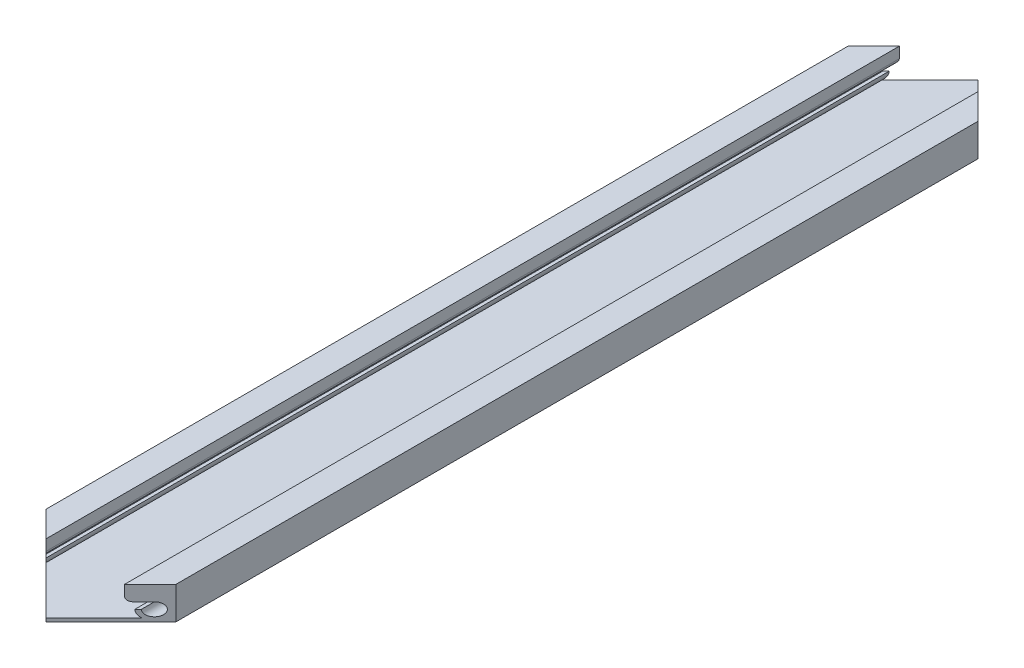
ISO-10303-21;
HEADER;
FILE_DESCRIPTION(('STEP AP214'),'2;1');
FILE_NAME('part.step','',(''),(''),'','','');
FILE_SCHEMA(('AUTOMOTIVE_DESIGN { 1 0 10303 214 1 1 1 1 }'));
ENDSEC;
DATA;
#1=APPLICATION_CONTEXT('core data for automotive mechanical design processes');
#2=APPLICATION_PROTOCOL_DEFINITION('international standard','automotive_design',2000,#1);
#3=PRODUCT_CONTEXT('',#1,'mechanical');
#4=PRODUCT('Part','Part','',(#3));
#5=PRODUCT_RELATED_PRODUCT_CATEGORY('part','',(#4));
#6=PRODUCT_DEFINITION_FORMATION('','',#4);
#7=PRODUCT_DEFINITION_CONTEXT('part definition',#1,'design');
#8=PRODUCT_DEFINITION('design','',#6,#7);
#9=PRODUCT_DEFINITION_SHAPE('','',#8);
#10=(LENGTH_UNIT() NAMED_UNIT(*) SI_UNIT(.MILLI.,.METRE.));
#11=(NAMED_UNIT(*) PLANE_ANGLE_UNIT() SI_UNIT($,.RADIAN.));
#12=(NAMED_UNIT(*) SI_UNIT($,.STERADIAN.) SOLID_ANGLE_UNIT());
#13=UNCERTAINTY_MEASURE_WITH_UNIT(LENGTH_MEASURE(1.E-05),#10,'distance_accuracy_value','');
#14=(GEOMETRIC_REPRESENTATION_CONTEXT(3) GLOBAL_UNCERTAINTY_ASSIGNED_CONTEXT((#13)) GLOBAL_UNIT_ASSIGNED_CONTEXT((#10,
#11,#12)) REPRESENTATION_CONTEXT('',''));
#15=CARTESIAN_POINT('',(0.,0.,0.));
#16=DIRECTION('',(0.,0.,1.));
#17=DIRECTION('',(1.,0.,0.));
#18=AXIS2_PLACEMENT_3D('',#15,#16,#17);
#19=CARTESIAN_POINT('',(-30.,-7.4999999999987,430.));
#20=DIRECTION('',(0.,1.,0.));
#21=DIRECTION('',(0.,0.,1.));
#22=AXIS2_PLACEMENT_3D('',#19,#20,#21);
#23=PLANE('',#22);
#24=DIRECTION('',(-0.707106781186552,0.,0.707106781186538));
#25=VECTOR('',#24,1.);
#26=CARTESIAN_POINT('',(215.000000000001,-7.4999999999987,215.000000000003));
#27=LINE('',#26,#25);
#28=CARTESIAN_POINT('',(30.,-7.49999999999998,400.000000000006));
#29=VERTEX_POINT('',#28);
#30=CARTESIAN_POINT('',(0.,-7.4999999999987,430.));
#31=VERTEX_POINT('',#30);
#32=EDGE_CURVE('E362',#29,#31,#27,.T.);
#33=ORIENTED_EDGE('',*,*,#32,.T.);
#34=DIRECTION('',(0.707106781186552,0.,0.707106781186538));
#35=VECTOR('',#34,1.);
#36=CARTESIAN_POINT('',(-215.,-7.50000000000001,215.000000000013));
#37=LINE('',#36,#35);
#38=CARTESIAN_POINT('',(-30.,-7.49999999999998,400.));
#39=VERTEX_POINT('',#38);
#40=EDGE_CURVE('E228',#39,#31,#37,.T.);
#41=ORIENTED_EDGE('',*,*,#40,.F.);
#42=DIRECTION('',(0.,0.,-1.));
#43=VECTOR('',#42,1.);
#44=CARTESIAN_POINT('',(-30.,-7.4999999999987,430.));
#45=LINE('',#44,#43);
#46=CARTESIAN_POINT('',(-30.,-7.4999999999987,29.9999999999998));
#47=VERTEX_POINT('',#46);
#48=EDGE_CURVE('E237',#39,#47,#45,.T.);
#49=ORIENTED_EDGE('',*,*,#48,.T.);
#50=DIRECTION('',(0.707106781186552,0.,-0.707106781186538));
#51=VECTOR('',#50,1.);
#52=CARTESIAN_POINT('',(0.,-7.50000000000001,-1.04360964314765E-11));
#53=LINE('',#52,#51);
#54=CARTESIAN_POINT('',(0.,-7.50000000000001,-1.04360964314765E-11));
#55=VERTEX_POINT('',#54);
#56=EDGE_CURVE('E366',#47,#55,#53,.T.);
#57=ORIENTED_EDGE('',*,*,#56,.T.);
#58=DIRECTION('',(-0.707106781186552,0.,-0.707106781186538));
#59=VECTOR('',#58,1.);
#60=CARTESIAN_POINT('',(0.,-7.50000000000001,-1.04360964314765E-11));
#61=LINE('',#60,#59);
#62=CARTESIAN_POINT('',(30.,-7.4999999999987,29.9999999999996));
#63=VERTEX_POINT('',#62);
#64=EDGE_CURVE('E365',#63,#55,#61,.T.);
#65=ORIENTED_EDGE('',*,*,#64,.F.);
#66=DIRECTION('',(0.,0.,-1.));
#67=VECTOR('',#66,1.);
#68=CARTESIAN_POINT('',(30.,-7.4999999999987,430.000000000005));
#69=LINE('',#68,#67);
#70=EDGE_CURVE('E252',#29,#63,#69,.T.);
#71=ORIENTED_EDGE('',*,*,#70,.F.);
#72=EDGE_LOOP('',(#33,#41,#49,#57,#65,#71));
#73=FACE_BOUND('',#72,.T.);
#74=ADVANCED_FACE('F80',(#73),#23,.F.);
#75=CARTESIAN_POINT('',(22.1715728752538,-5.9999999999987,430.));
#76=DIRECTION('',(0.,-1.,0.));
#77=DIRECTION('',(0.,0.,-1.));
#78=AXIS2_PLACEMENT_3D('',#75,#76,#77);
#79=PLANE('',#78);
#80=DIRECTION('',(0.,0.,-1.));
#81=VECTOR('',#80,1.);
#82=CARTESIAN_POINT('',(-22.1715728752538,-5.9999999999987,430.));
#83=LINE('',#82,#81);
#84=CARTESIAN_POINT('',(-22.1715728752538,-5.99999999999998,407.828427124752));
#85=VERTEX_POINT('',#84);
#86=CARTESIAN_POINT('',(-22.1715728752538,-6.00000000000001,22.1715728752638));
#87=VERTEX_POINT('',#86);
#88=EDGE_CURVE('E343',#85,#87,#83,.T.);
#89=ORIENTED_EDGE('',*,*,#88,.F.);
#90=DIRECTION('',(0.707106781186552,0.,0.707106781186538));
#91=VECTOR('',#90,1.);
#92=CARTESIAN_POINT('',(11.085786437627,-6.00000000000001,441.085786437632));
#93=LINE('',#92,#91);
#94=CARTESIAN_POINT('',(0.,-5.9999999999987,430.));
#95=VERTEX_POINT('',#94);
#96=EDGE_CURVE('E417',#85,#95,#93,.T.);
#97=ORIENTED_EDGE('',*,*,#96,.T.);
#98=DIRECTION('',(-0.707106781186552,0.,0.707106781186538));
#99=VECTOR('',#98,1.);
#100=CARTESIAN_POINT('',(11.0857864376271,-6.00000000000001,418.914213562373));
#101=LINE('',#100,#99);
#102=CARTESIAN_POINT('',(22.1715728752538,-5.99999999999998,407.828427124747));
#103=VERTEX_POINT('',#102);
#104=EDGE_CURVE('E320',#103,#95,#101,.T.);
#105=ORIENTED_EDGE('',*,*,#104,.F.);
#106=DIRECTION('',(0.,0.,-1.));
#107=VECTOR('',#106,1.);
#108=CARTESIAN_POINT('',(22.1715728752538,-5.9999999999987,430.));
#109=LINE('',#108,#107);
#110=CARTESIAN_POINT('',(22.1715728752537,-6.00000000000001,22.1715728752536));
#111=VERTEX_POINT('',#110);
#112=EDGE_CURVE('E326',#103,#111,#109,.T.);
#113=ORIENTED_EDGE('',*,*,#112,.T.);
#114=DIRECTION('',(-0.707106781186552,0.,-0.707106781186538));
#115=VECTOR('',#114,1.);
#116=CARTESIAN_POINT('',(226.085786437627,-5.9999999999987,226.08578643763));
#117=LINE('',#116,#115);
#118=CARTESIAN_POINT('',(0.,-5.9999999999987,0.));
#119=VERTEX_POINT('',#118);
#120=EDGE_CURVE('E311',#111,#119,#117,.T.);
#121=ORIENTED_EDGE('',*,*,#120,.T.);
#122=DIRECTION('',(0.707106781186552,0.,-0.707106781186538));
#123=VECTOR('',#122,1.);
#124=CARTESIAN_POINT('',(-203.914213562373,-5.99999999999998,203.914213562371));
#125=LINE('',#124,#123);
#126=EDGE_CURVE('E370',#87,#119,#125,.T.);
#127=ORIENTED_EDGE('',*,*,#126,.F.);
#128=EDGE_LOOP('',(#89,#97,#105,#113,#121,#127));
#129=FACE_BOUND('',#128,.T.);
#130=ADVANCED_FACE('F402',(#129),#79,.F.);
#131=CARTESIAN_POINT('',(-30.,7.49999999999998,430.));
#132=DIRECTION('',(0.,-1.,0.));
#133=DIRECTION('',(0.,0.,-1.));
#134=AXIS2_PLACEMENT_3D('',#131,#132,#133);
#135=PLANE('',#134);
#136=DIRECTION('',(0.,0.,-1.));
#137=VECTOR('',#136,1.);
#138=CARTESIAN_POINT('',(-30.,7.49999999999998,430.));
#139=LINE('',#138,#137);
#140=CARTESIAN_POINT('',(-30.,7.50000000000001,400.));
#141=VERTEX_POINT('',#140);
#142=CARTESIAN_POINT('',(-30.,7.50000000000001,29.9999999999998));
#143=VERTEX_POINT('',#142);
#144=EDGE_CURVE('E235',#141,#143,#139,.T.);
#145=ORIENTED_EDGE('',*,*,#144,.F.);
#146=DIRECTION('',(0.707106781186552,0.,0.707106781186538));
#147=VECTOR('',#146,1.);
#148=CARTESIAN_POINT('',(-215.,7.50000000000131,215.000000000008));
#149=LINE('',#148,#147);
#150=CARTESIAN_POINT('',(-18.1568883594903,7.50000000000003,411.84311164051));
#151=VERTEX_POINT('',#150);
#152=EDGE_CURVE('E216',#141,#151,#149,.T.);
#153=ORIENTED_EDGE('',*,*,#152,.T.);
#154=DIRECTION('',(0.,0.,-1.));
#155=VECTOR('',#154,1.);
#156=CARTESIAN_POINT('',(-18.1568883594903,7.49999999999998,430.));
#157=LINE('',#156,#155);
#158=CARTESIAN_POINT('',(-18.1568883594903,7.50000000000001,18.1568883594903));
#159=VERTEX_POINT('',#158);
#160=EDGE_CURVE('E323',#151,#159,#157,.T.);
#161=ORIENTED_EDGE('',*,*,#160,.T.);
#162=DIRECTION('',(0.707106781186552,0.,-0.707106781186538));
#163=VECTOR('',#162,1.);
#164=CARTESIAN_POINT('',(0.,7.50000000000001,-1.04360964314765E-11));
#165=LINE('',#164,#163);
#166=EDGE_CURVE('E243',#143,#159,#165,.T.);
#167=ORIENTED_EDGE('',*,*,#166,.F.);
#168=EDGE_LOOP('',(#145,#153,#161,#167));
#169=FACE_BOUND('',#168,.T.);
#170=ADVANCED_FACE('F242',(#169),#135,.F.);
#171=CARTESIAN_POINT('',(25.,0.5,430.));
#172=DIRECTION('',(0.,1.,0.));
#173=DIRECTION('',(-1.,0.,0.));
#174=AXIS2_PLACEMENT_3D('',#171,#172,#173);
#175=PLANE('',#174);
#176=DIRECTION('',(0.,0.,-1.));
#177=VECTOR('',#176,1.);
#178=CARTESIAN_POINT('',(-20.1568883594903,0.5,430.));
#179=LINE('',#178,#177);
#180=CARTESIAN_POINT('',(-20.1568883594902,0.5,20.1568883595005));
#181=VERTEX_POINT('',#180);
#182=CARTESIAN_POINT('',(-20.1568883594903,0.500000000001305,409.84311164051));
#183=VERTEX_POINT('',#182);
#184=EDGE_CURVE('E267',#181,#183,#179,.F.);
#185=ORIENTED_EDGE('',*,*,#184,.T.);
#186=DIRECTION('',(-0.707106781186552,0.,-0.707106781186538));
#187=VECTOR('',#186,1.);
#188=CARTESIAN_POINT('',(12.5000000000002,0.5,442.500000000005));
#189=LINE('',#188,#187);
#190=CARTESIAN_POINT('',(-25.,0.500000000001305,405.));
#191=VERTEX_POINT('',#190);
#192=EDGE_CURVE('E466',#183,#191,#189,.T.);
#193=ORIENTED_EDGE('',*,*,#192,.T.);
#194=DIRECTION('',(0.,0.,-1.));
#195=VECTOR('',#194,1.);
#196=CARTESIAN_POINT('',(-25.,0.5,430.));
#197=LINE('',#196,#195);
#198=CARTESIAN_POINT('',(-25.,0.500000000001305,24.9999999999995));
#199=VERTEX_POINT('',#198);
#200=EDGE_CURVE('E335',#191,#199,#197,.T.);
#201=ORIENTED_EDGE('',*,*,#200,.T.);
#202=DIRECTION('',(-0.707106781186552,0.,0.707106781186538));
#203=VECTOR('',#202,1.);
#204=CARTESIAN_POINT('',(-202.5,0.500000000001305,202.499999999997));
#205=LINE('',#204,#203);
#206=EDGE_CURVE('E434',#181,#199,#205,.T.);
#207=ORIENTED_EDGE('',*,*,#206,.F.);
#208=EDGE_LOOP('',(#185,#193,#201,#207));
#209=FACE_BOUND('',#208,.T.);
#210=ADVANCED_FACE('F491',(#209),#175,.F.);
#211=CARTESIAN_POINT('',(-30.,7.49999999999998,430.));
#212=DIRECTION('',(1.,0.,0.));
#213=DIRECTION('',(0.,1.,0.));
#214=AXIS2_PLACEMENT_3D('',#211,#212,#213);
#215=PLANE('',#214);
#216=ORIENTED_EDGE('',*,*,#48,.F.);
#217=DIRECTION('',(0.,-1.,0.));
#218=VECTOR('',#217,1.);
#219=CARTESIAN_POINT('',(-30.,7.50000000000001,400.));
#220=LINE('',#219,#218);
#221=EDGE_CURVE('E219',#141,#39,#220,.T.);
#222=ORIENTED_EDGE('',*,*,#221,.F.);
#223=ORIENTED_EDGE('',*,*,#144,.T.);
#224=DIRECTION('',(0.,-1.,0.));
#225=VECTOR('',#224,1.);
#226=CARTESIAN_POINT('',(-30.,7.50000000000001,29.9999999999998));
#227=LINE('',#226,#225);
#228=EDGE_CURVE('E453',#143,#47,#227,.T.);
#229=ORIENTED_EDGE('',*,*,#228,.T.);
#230=EDGE_LOOP('',(#216,#222,#223,#229));
#231=FACE_BOUND('',#230,.T.);
#232=ADVANCED_FACE('F233',(#231),#215,.F.);
#233=CARTESIAN_POINT('',(-25.,-2.4999999999987,430.));
#234=DIRECTION('',(0.,0.,-1.));
#235=DIRECTION('',(-1.,0.,0.));
#236=AXIS2_PLACEMENT_3D('',#233,#234,#235);
#237=CYLINDRICAL_SURFACE('',#236,3.);
#238=ORIENTED_EDGE('',*,*,#200,.F.);
#239=CARTESIAN_POINT('',(-25.,-2.5,405.));
#240=DIRECTION('',(0.707106781186544,0.,-0.707106781186546));
#241=DIRECTION('',(-0.707106781186552,0.,-0.707106781186538));
#242=AXIS2_PLACEMENT_3D('',#239,#240,#241);
#243=ELLIPSE('',#242,4.24264068711927,3.);
#244=CARTESIAN_POINT('',(-22.,-2.5,408.000000000005));
#245=VERTEX_POINT('',#244);
#246=EDGE_CURVE('E470',#191,#245,#243,.F.);
#247=ORIENTED_EDGE('',*,*,#246,.T.);
#248=DIRECTION('',(0.,0.,-1.));
#249=VECTOR('',#248,1.);
#250=CARTESIAN_POINT('',(-22.,-2.4999999999987,430.));
#251=LINE('',#250,#249);
#252=CARTESIAN_POINT('',(-22.,-2.4999999999987,22.00000000001));
#253=VERTEX_POINT('',#252);
#254=EDGE_CURVE('E259',#245,#253,#251,.T.);
#255=ORIENTED_EDGE('',*,*,#254,.T.);
#256=CARTESIAN_POINT('',(-25.,-2.4999999999987,24.9999999999997));
#257=DIRECTION('',(-0.707106781186543,0.,-0.707106781186546));
#258=DIRECTION('',(0.707106781186552,0.,-0.707106781186538));
#259=AXIS2_PLACEMENT_3D('',#256,#257,#258);
#260=ELLIPSE('',#259,4.24264068711927,3.);
#261=EDGE_CURVE('E437',#199,#253,#260,.F.);
#262=ORIENTED_EDGE('',*,*,#261,.F.);
#263=EDGE_LOOP('',(#238,#247,#255,#262));
#264=FACE_BOUND('',#263,.T.);
#265=ADVANCED_FACE('F488',(#264),#237,.F.);
#266=CARTESIAN_POINT('',(-25.,-2.4999999999987,430.));
#267=DIRECTION('',(0.,-1.,0.));
#268=DIRECTION('',(1.,0.,0.));
#269=AXIS2_PLACEMENT_3D('',#266,#267,#268);
#270=PLANE('',#269);
#271=ORIENTED_EDGE('',*,*,#254,.F.);
#272=DIRECTION('',(0.707106781186552,0.,0.707106781186538));
#273=VECTOR('',#272,1.);
#274=CARTESIAN_POINT('',(-12.5000000000001,-2.5,417.5));
#275=LINE('',#274,#273);
#276=CARTESIAN_POINT('',(-20.5,-2.4999999999987,409.5));
#277=VERTEX_POINT('',#276);
#278=EDGE_CURVE('E428',#245,#277,#275,.T.);
#279=ORIENTED_EDGE('',*,*,#278,.T.);
#280=DIRECTION('',(0.,0.,-1.));
#281=VECTOR('',#280,1.);
#282=CARTESIAN_POINT('',(-20.5,-2.4999999999987,430.));
#283=LINE('',#282,#281);
#284=CARTESIAN_POINT('',(-20.5,-2.49999999999992,20.4999999999895));
#285=VERTEX_POINT('',#284);
#286=EDGE_CURVE('E339',#277,#285,#283,.T.);
#287=ORIENTED_EDGE('',*,*,#286,.T.);
#288=DIRECTION('',(0.707106781186552,0.,-0.707106781186538));
#289=VECTOR('',#288,1.);
#290=CARTESIAN_POINT('',(-227.5,-2.49999999999864,227.499999999997));
#291=LINE('',#290,#289);
#292=EDGE_CURVE('E440',#253,#285,#291,.T.);
#293=ORIENTED_EDGE('',*,*,#292,.F.);
#294=EDGE_LOOP('',(#271,#279,#287,#293));
#295=FACE_BOUND('',#294,.T.);
#296=ADVANCED_FACE('F478',(#295),#270,.F.);
#297=CARTESIAN_POINT('',(-25.,-2.4999999999987,430.));
#298=DIRECTION('',(0.,0.,-1.));
#299=DIRECTION('',(-1.,0.,0.));
#300=AXIS2_PLACEMENT_3D('',#297,#298,#299);
#301=CYLINDRICAL_SURFACE('',#300,4.5);
#302=ORIENTED_EDGE('',*,*,#286,.F.);
#303=CARTESIAN_POINT('',(-25.,-2.5,405.));
#304=DIRECTION('',(0.707106781186544,0.,-0.707106781186546));
#305=DIRECTION('',(-0.707106781186552,0.,-0.707106781186538));
#306=AXIS2_PLACEMENT_3D('',#303,#304,#305);
#307=ELLIPSE('',#306,6.3639610306789,4.5);
#308=EDGE_CURVE('E421',#277,#85,#307,.T.);
#309=ORIENTED_EDGE('',*,*,#308,.T.);
#310=ORIENTED_EDGE('',*,*,#88,.T.);
#311=CARTESIAN_POINT('',(-25.,-2.4999999999987,24.9999999999997));
#312=DIRECTION('',(-0.707106781186543,0.,-0.707106781186546));
#313=DIRECTION('',(0.707106781186552,0.,-0.707106781186538));
#314=AXIS2_PLACEMENT_3D('',#311,#312,#313);
#315=ELLIPSE('',#314,6.3639610306789,4.5);
#316=EDGE_CURVE('E375',#285,#87,#315,.T.);
#317=ORIENTED_EDGE('',*,*,#316,.F.);
#318=EDGE_LOOP('',(#302,#309,#310,#317));
#319=FACE_BOUND('',#318,.T.);
#320=ADVANCED_FACE('F482',(#319),#301,.T.);
#321=CARTESIAN_POINT('',(-18.1568883594903,7.49999999999998,430.));
#322=DIRECTION('',(-1.,0.,0.));
#323=DIRECTION('',(0.,0.,1.));
#324=AXIS2_PLACEMENT_3D('',#321,#322,#323);
#325=PLANE('',#324);
#326=ORIENTED_EDGE('',*,*,#160,.F.);
#327=DIRECTION('',(0.,-1.,0.));
#328=VECTOR('',#327,1.);
#329=CARTESIAN_POINT('',(-18.1568883594903,7.50000000000003,411.84311164051));
#330=LINE('',#329,#328);
#331=CARTESIAN_POINT('',(-18.1568883594903,2.50000000000131,411.84311164051));
#332=VERTEX_POINT('',#331);
#333=EDGE_CURVE('E222',#151,#332,#330,.T.);
#334=ORIENTED_EDGE('',*,*,#333,.T.);
#335=DIRECTION('',(0.,0.,-1.));
#336=VECTOR('',#335,1.);
#337=CARTESIAN_POINT('',(-18.1568883594903,2.50000000000131,430.000000000005));
#338=LINE('',#337,#336);
#339=CARTESIAN_POINT('',(-18.1568883594903,2.5,18.1568883595005));
#340=VERTEX_POINT('',#339);
#341=EDGE_CURVE('E263',#332,#340,#338,.T.);
#342=ORIENTED_EDGE('',*,*,#341,.T.);
#343=DIRECTION('',(0.,-1.,0.));
#344=VECTOR('',#343,1.);
#345=CARTESIAN_POINT('',(-18.1568883594903,7.50000000000001,18.15688835949));
#346=LINE('',#345,#344);
#347=EDGE_CURVE('E426',#159,#340,#346,.T.);
#348=ORIENTED_EDGE('',*,*,#347,.F.);
#349=EDGE_LOOP('',(#326,#334,#342,#348));
#350=FACE_BOUND('',#349,.T.);
#351=ADVANCED_FACE('F498',(#350),#325,.F.);
#352=CARTESIAN_POINT('',(-20.1568883594903,2.50000000000131,430.000000000005));
#353=DIRECTION('',(0.,0.,-1.));
#354=DIRECTION('',(-1.,0.,0.));
#355=AXIS2_PLACEMENT_3D('',#352,#353,#354);
#356=CYLINDRICAL_SURFACE('',#355,2.);
#357=CARTESIAN_POINT('',(-20.1568883594903,2.5,409.84311164051));
#358=DIRECTION('',(0.707106781186544,0.,-0.707106781186546));
#359=DIRECTION('',(-0.707106781186552,0.,-0.707106781186538));
#360=AXIS2_PLACEMENT_3D('',#357,#358,#359);
#361=ELLIPSE('',#360,2.82842712474617,2.);
#362=EDGE_CURVE('E239',#183,#332,#361,.F.);
#363=ORIENTED_EDGE('',*,*,#362,.F.);
#364=ORIENTED_EDGE('',*,*,#184,.F.);
#365=CARTESIAN_POINT('',(-20.1568883594902,2.5,20.15688835949));
#366=DIRECTION('',(-0.707106781186543,0.,-0.707106781186546));
#367=DIRECTION('',(0.707106781186552,0.,-0.707106781186538));
#368=AXIS2_PLACEMENT_3D('',#365,#366,#367);
#369=ELLIPSE('',#368,2.82842712474617,2.);
#370=EDGE_CURVE('E420',#181,#340,#369,.F.);
#371=ORIENTED_EDGE('',*,*,#370,.T.);
#372=ORIENTED_EDGE('',*,*,#341,.F.);
#373=EDGE_LOOP('',(#363,#364,#371,#372));
#374=FACE_BOUND('',#373,.T.);
#375=ADVANCED_FACE('F495',(#374),#356,.T.);
#376=CARTESIAN_POINT('',(30.,7.49999999999998,430.));
#377=DIRECTION('',(-1.,0.,0.));
#378=DIRECTION('',(0.,-1.,0.));
#379=AXIS2_PLACEMENT_3D('',#376,#377,#378);
#380=PLANE('',#379);
#381=DIRECTION('',(0.,-1.,0.));
#382=VECTOR('',#381,1.);
#383=CARTESIAN_POINT('',(30.,7.50000000000001,400.));
#384=LINE('',#383,#382);
#385=CARTESIAN_POINT('',(30.,7.50000000000001,400.));
#386=VERTEX_POINT('',#385);
#387=EDGE_CURVE('E358',#386,#29,#384,.T.);
#388=ORIENTED_EDGE('',*,*,#387,.T.);
#389=ORIENTED_EDGE('',*,*,#70,.T.);
#390=DIRECTION('',(0.,-1.,0.));
#391=VECTOR('',#390,1.);
#392=CARTESIAN_POINT('',(30.,7.5000000000012,29.9999999999894));
#393=LINE('',#392,#391);
#394=CARTESIAN_POINT('',(30.,7.5000000000012,29.9999999999894));
#395=VERTEX_POINT('',#394);
#396=EDGE_CURVE('E357',#395,#63,#393,.T.);
#397=ORIENTED_EDGE('',*,*,#396,.F.);
#398=DIRECTION('',(0.,0.,-1.));
#399=VECTOR('',#398,1.);
#400=CARTESIAN_POINT('',(30.,7.49999999999998,430.));
#401=LINE('',#400,#399);
#402=EDGE_CURVE('E245',#386,#395,#401,.T.);
#403=ORIENTED_EDGE('',*,*,#402,.F.);
#404=EDGE_LOOP('',(#388,#389,#397,#403));
#405=FACE_BOUND('',#404,.T.);
#406=ADVANCED_FACE('F355',(#405),#380,.F.);
#407=DIRECTION('',(-0.707106781186552,0.,0.707106781186538));
#408=VECTOR('',#407,1.);
#409=CARTESIAN_POINT('',(215.000000000001,7.50000000000128,215.000000000003));
#410=LINE('',#409,#408);
#411=CARTESIAN_POINT('',(18.1431116405097,7.50000000000128,411.85688835949));
#412=VERTEX_POINT('',#411);
#413=EDGE_CURVE('E445',#386,#412,#410,.T.);
#414=ORIENTED_EDGE('',*,*,#413,.F.);
#415=ORIENTED_EDGE('',*,*,#402,.T.);
#416=DIRECTION('',(-0.707106781186552,0.,-0.707106781186538));
#417=VECTOR('',#416,1.);
#418=CARTESIAN_POINT('',(0.,7.50000000000001,-1.04360964314765E-11));
#419=LINE('',#418,#417);
#420=CARTESIAN_POINT('',(18.1431116405097,7.50000000000131,18.1431116405095));
#421=VERTEX_POINT('',#420);
#422=EDGE_CURVE('E369',#395,#421,#419,.T.);
#423=ORIENTED_EDGE('',*,*,#422,.T.);
#424=DIRECTION('',(0.,0.,-1.));
#425=VECTOR('',#424,1.);
#426=CARTESIAN_POINT('',(18.1431116405097,7.49999999999998,430.));
#427=LINE('',#426,#425);
#428=EDGE_CURVE('E290',#412,#421,#427,.T.);
#429=ORIENTED_EDGE('',*,*,#428,.F.);
#430=EDGE_LOOP('',(#414,#415,#423,#429));
#431=FACE_BOUND('',#430,.T.);
#432=ADVANCED_FACE('F520',(#431),#135,.F.);
#433=CARTESIAN_POINT('',(25.,-2.4999999999987,430.));
#434=DIRECTION('',(0.,0.,-1.));
#435=DIRECTION('',(-1.,0.,0.));
#436=AXIS2_PLACEMENT_3D('',#433,#434,#435);
#437=CYLINDRICAL_SURFACE('',#436,3.);
#438=CARTESIAN_POINT('',(25.,-2.5,405.000000000006));
#439=DIRECTION('',(0.707106781186543,0.,0.707106781186546));
#440=DIRECTION('',(0.707106781186552,0.,-0.707106781186538));
#441=AXIS2_PLACEMENT_3D('',#438,#439,#440);
#442=ELLIPSE('',#441,4.24264068711926,3.);
#443=CARTESIAN_POINT('',(25.,0.500000000001305,405.000000000006));
#444=VERTEX_POINT('',#443);
#445=CARTESIAN_POINT('',(22.,-2.5,408.));
#446=VERTEX_POINT('',#445);
#447=EDGE_CURVE('E305',#444,#446,#442,.F.);
#448=ORIENTED_EDGE('',*,*,#447,.F.);
#449=DIRECTION('',(0.,0.,-1.));
#450=VECTOR('',#449,1.);
#451=CARTESIAN_POINT('',(25.,0.5,430.));
#452=LINE('',#451,#450);
#453=CARTESIAN_POINT('',(25.,0.500000000001305,24.9999999999893));
#454=VERTEX_POINT('',#453);
#455=EDGE_CURVE('E303',#444,#454,#452,.T.);
#456=ORIENTED_EDGE('',*,*,#455,.T.);
#457=CARTESIAN_POINT('',(25.,-2.4999999999987,24.9999999999997));
#458=DIRECTION('',(-0.707106781186543,0.,0.707106781186547));
#459=DIRECTION('',(-0.707106781186552,0.,-0.707106781186538));
#460=AXIS2_PLACEMENT_3D('',#457,#458,#459);
#461=ELLIPSE('',#460,4.24264068711926,3.);
#462=CARTESIAN_POINT('',(22.,-2.4999999999987,21.9999999999998));
#463=VERTEX_POINT('',#462);
#464=EDGE_CURVE('E386',#454,#463,#461,.F.);
#465=ORIENTED_EDGE('',*,*,#464,.T.);
#466=DIRECTION('',(0.,0.,-1.));
#467=VECTOR('',#466,1.);
#468=CARTESIAN_POINT('',(22.,-2.4999999999987,430.));
#469=LINE('',#468,#467);
#470=EDGE_CURVE('E250',#463,#446,#469,.F.);
#471=ORIENTED_EDGE('',*,*,#470,.T.);
#472=EDGE_LOOP('',(#448,#456,#465,#471));
#473=FACE_BOUND('',#472,.T.);
#474=ADVANCED_FACE('F414',(#473),#437,.F.);
#475=DIRECTION('',(0.707106781186552,0.,-0.707106781186538));
#476=VECTOR('',#475,1.);
#477=CARTESIAN_POINT('',(12.5000000000002,0.5,417.5));
#478=LINE('',#477,#476);
#479=CARTESIAN_POINT('',(20.1431116405097,0.5,409.85688835949));
#480=VERTEX_POINT('',#479);
#481=EDGE_CURVE('E297',#480,#444,#478,.T.);
#482=ORIENTED_EDGE('',*,*,#481,.F.);
#483=DIRECTION('',(0.,0.,-1.));
#484=VECTOR('',#483,1.);
#485=CARTESIAN_POINT('',(20.1431116405097,0.5,430.));
#486=LINE('',#485,#484);
#487=CARTESIAN_POINT('',(20.1431116405097,0.5,20.1431116405095));
#488=VERTEX_POINT('',#487);
#489=EDGE_CURVE('E271',#480,#488,#486,.T.);
#490=ORIENTED_EDGE('',*,*,#489,.T.);
#491=DIRECTION('',(0.707106781186552,0.,0.707106781186538));
#492=VECTOR('',#491,1.);
#493=CARTESIAN_POINT('',(227.500000000001,0.5,227.499999999997));
#494=LINE('',#493,#492);
#495=EDGE_CURVE('E96',#488,#454,#494,.T.);
#496=ORIENTED_EDGE('',*,*,#495,.T.);
#497=ORIENTED_EDGE('',*,*,#455,.F.);
#498=EDGE_LOOP('',(#482,#490,#496,#497));
#499=FACE_BOUND('',#498,.T.);
#500=ADVANCED_FACE('F301',(#499),#175,.F.);
#501=CARTESIAN_POINT('',(20.5,-2.4999999999987,430.));
#502=DIRECTION('',(0.,-1.,0.));
#503=DIRECTION('',(1.,0.,0.));
#504=AXIS2_PLACEMENT_3D('',#501,#502,#503);
#505=PLANE('',#504);
#506=DIRECTION('',(-0.707106781186552,0.,0.707106781186538));
#507=VECTOR('',#506,1.);
#508=CARTESIAN_POINT('',(10.2500000000005,-2.49999999999972,419.750000000005));
#509=LINE('',#508,#507);
#510=CARTESIAN_POINT('',(20.5,-2.4999999999987,409.5));
#511=VERTEX_POINT('',#510);
#512=EDGE_CURVE('E309',#446,#511,#509,.T.);
#513=ORIENTED_EDGE('',*,*,#512,.F.);
#514=ORIENTED_EDGE('',*,*,#470,.F.);
#515=DIRECTION('',(-0.707106781186552,0.,-0.707106781186538));
#516=VECTOR('',#515,1.);
#517=CARTESIAN_POINT('',(225.25,-2.50000000000003,225.250000000003));
#518=LINE('',#517,#516);
#519=CARTESIAN_POINT('',(20.5,-2.49999999999959,20.4999999999893));
#520=VERTEX_POINT('',#519);
#521=EDGE_CURVE('E390',#463,#520,#518,.T.);
#522=ORIENTED_EDGE('',*,*,#521,.T.);
#523=DIRECTION('',(0.,0.,-1.));
#524=VECTOR('',#523,1.);
#525=CARTESIAN_POINT('',(20.5,-2.4999999999987,430.));
#526=LINE('',#525,#524);
#527=EDGE_CURVE('E329',#511,#520,#526,.T.);
#528=ORIENTED_EDGE('',*,*,#527,.F.);
#529=EDGE_LOOP('',(#513,#514,#522,#528));
#530=FACE_BOUND('',#529,.T.);
#531=ADVANCED_FACE('F411',(#530),#505,.F.);
#532=CARTESIAN_POINT('',(25.,-2.4999999999987,430.));
#533=DIRECTION('',(0.,0.,-1.));
#534=DIRECTION('',(-1.,0.,0.));
#535=AXIS2_PLACEMENT_3D('',#532,#533,#534);
#536=CYLINDRICAL_SURFACE('',#535,4.5);
#537=CARTESIAN_POINT('',(25.,-2.5,405.000000000006));
#538=DIRECTION('',(0.707106781186543,0.,0.707106781186546));
#539=DIRECTION('',(0.707106781186552,0.,-0.707106781186538));
#540=AXIS2_PLACEMENT_3D('',#537,#538,#539);
#541=ELLIPSE('',#540,6.36396103067889,4.5);
#542=EDGE_CURVE('E317',#511,#103,#541,.T.);
#543=ORIENTED_EDGE('',*,*,#542,.F.);
#544=ORIENTED_EDGE('',*,*,#527,.T.);
#545=CARTESIAN_POINT('',(25.,-2.4999999999987,24.9999999999997));
#546=DIRECTION('',(-0.707106781186543,0.,0.707106781186547));
#547=DIRECTION('',(-0.707106781186552,0.,-0.707106781186538));
#548=AXIS2_PLACEMENT_3D('',#545,#546,#547);
#549=ELLIPSE('',#548,6.36396103067889,4.5);
#550=EDGE_CURVE('E394',#520,#111,#549,.T.);
#551=ORIENTED_EDGE('',*,*,#550,.T.);
#552=ORIENTED_EDGE('',*,*,#112,.F.);
#553=EDGE_LOOP('',(#543,#544,#551,#552));
#554=FACE_BOUND('',#553,.T.);
#555=ADVANCED_FACE('F407',(#554),#536,.T.);
#556=CARTESIAN_POINT('',(18.1431116405097,0.5,430.));
#557=DIRECTION('',(1.,0.,0.));
#558=DIRECTION('',(0.,0.,-1.));
#559=AXIS2_PLACEMENT_3D('',#556,#557,#558);
#560=PLANE('',#559);
#561=DIRECTION('',(0.,-1.,0.));
#562=VECTOR('',#561,1.);
#563=CARTESIAN_POINT('',(18.1431116405097,0.500000000001305,411.856888359491));
#564=LINE('',#563,#562);
#565=CARTESIAN_POINT('',(18.1431116405097,2.50000000000131,411.856888359491));
#566=VERTEX_POINT('',#565);
#567=EDGE_CURVE('E104',#412,#566,#564,.T.);
#568=ORIENTED_EDGE('',*,*,#567,.F.);
#569=ORIENTED_EDGE('',*,*,#428,.T.);
#570=DIRECTION('',(0.,-1.,0.));
#571=VECTOR('',#570,1.);
#572=CARTESIAN_POINT('',(18.1431116405097,0.5,18.1431116405095));
#573=LINE('',#572,#571);
#574=CARTESIAN_POINT('',(18.1431116405097,2.50000000000131,18.1431116405095));
#575=VERTEX_POINT('',#574);
#576=EDGE_CURVE('E281',#421,#575,#573,.T.);
#577=ORIENTED_EDGE('',*,*,#576,.T.);
#578=DIRECTION('',(0.,0.,-1.));
#579=VECTOR('',#578,1.);
#580=CARTESIAN_POINT('',(18.1431116405097,2.50000000000131,430.));
#581=LINE('',#580,#579);
#582=EDGE_CURVE('E275',#575,#566,#581,.F.);
#583=ORIENTED_EDGE('',*,*,#582,.T.);
#584=EDGE_LOOP('',(#568,#569,#577,#583));
#585=FACE_BOUND('',#584,.T.);
#586=ADVANCED_FACE('F288',(#585),#560,.F.);
#587=CARTESIAN_POINT('',(20.1431116405097,2.50000000000131,430.));
#588=DIRECTION('',(0.,0.,-1.));
#589=DIRECTION('',(-1.,0.,0.));
#590=AXIS2_PLACEMENT_3D('',#587,#588,#589);
#591=CYLINDRICAL_SURFACE('',#590,2.);
#592=ORIENTED_EDGE('',*,*,#489,.F.);
#593=CARTESIAN_POINT('',(20.1431116405097,2.50000000000131,409.85688835949));
#594=DIRECTION('',(0.707106781186543,0.,0.707106781186546));
#595=DIRECTION('',(0.707106781186552,0.,-0.707106781186538));
#596=AXIS2_PLACEMENT_3D('',#593,#594,#595);
#597=ELLIPSE('',#596,2.82842712474617,2.);
#598=EDGE_CURVE('E12',#480,#566,#597,.F.);
#599=ORIENTED_EDGE('',*,*,#598,.T.);
#600=ORIENTED_EDGE('',*,*,#582,.F.);
#601=CARTESIAN_POINT('',(20.1431116405097,2.50000000000131,20.14311164052));
#602=DIRECTION('',(-0.707106781186543,0.,0.707106781186547));
#603=DIRECTION('',(-0.707106781186552,0.,-0.707106781186538));
#604=AXIS2_PLACEMENT_3D('',#601,#602,#603);
#605=ELLIPSE('',#604,2.82842712474617,2.);
#606=EDGE_CURVE('E89',#488,#575,#605,.F.);
#607=ORIENTED_EDGE('',*,*,#606,.F.);
#608=EDGE_LOOP('',(#592,#599,#600,#607));
#609=FACE_BOUND('',#608,.T.);
#610=ADVANCED_FACE('F82',(#609),#591,.T.);
#611=CARTESIAN_POINT('',(0.,7.50000000000001,-1.04360964314765E-11));
#612=DIRECTION('',(-0.707106781186543,0.,0.707106781186547));
#613=DIRECTION('',(0.707106781186552,0.,0.707106781186538));
#614=AXIS2_PLACEMENT_3D('',#611,#612,#613);
#615=PLANE('',#614);
#616=ORIENTED_EDGE('',*,*,#550,.F.);
#617=ORIENTED_EDGE('',*,*,#521,.F.);
#618=ORIENTED_EDGE('',*,*,#464,.F.);
#619=ORIENTED_EDGE('',*,*,#495,.F.);
#620=ORIENTED_EDGE('',*,*,#606,.T.);
#621=ORIENTED_EDGE('',*,*,#576,.F.);
#622=ORIENTED_EDGE('',*,*,#422,.F.);
#623=ORIENTED_EDGE('',*,*,#396,.T.);
#624=ORIENTED_EDGE('',*,*,#64,.T.);
#625=DIRECTION('',(0.,-1.,0.));
#626=VECTOR('',#625,1.);
#627=CARTESIAN_POINT('',(0.,7.50000000000001,-1.04360964314765E-11));
#628=LINE('',#627,#626);
#629=EDGE_CURVE('E379',#119,#55,#628,.T.);
#630=ORIENTED_EDGE('',*,*,#629,.F.);
#631=ORIENTED_EDGE('',*,*,#120,.F.);
#632=EDGE_LOOP('',(#616,#617,#618,#619,#620,#621,#622,#623,#624,#630,#631));
#633=FACE_BOUND('',#632,.T.);
#634=ADVANCED_FACE('F280',(#633),#615,.F.);
#635=CARTESIAN_POINT('',(215.000000000001,7.50000000000128,215.000000000003));
#636=DIRECTION('',(0.707106781186543,0.,0.707106781186546));
#637=DIRECTION('',(0.707106781186552,0.,-0.707106781186538));
#638=AXIS2_PLACEMENT_3D('',#635,#636,#637);
#639=PLANE('',#638);
#640=ORIENTED_EDGE('',*,*,#104,.T.);
#641=DIRECTION('',(0.,-1.,0.));
#642=VECTOR('',#641,1.);
#643=CARTESIAN_POINT('',(0.,7.49999999999998,430.));
#644=LINE('',#643,#642);
#645=EDGE_CURVE('E292',#95,#31,#644,.T.);
#646=ORIENTED_EDGE('',*,*,#645,.T.);
#647=ORIENTED_EDGE('',*,*,#32,.F.);
#648=ORIENTED_EDGE('',*,*,#387,.F.);
#649=ORIENTED_EDGE('',*,*,#413,.T.);
#650=ORIENTED_EDGE('',*,*,#567,.T.);
#651=ORIENTED_EDGE('',*,*,#598,.F.);
#652=ORIENTED_EDGE('',*,*,#481,.T.);
#653=ORIENTED_EDGE('',*,*,#447,.T.);
#654=ORIENTED_EDGE('',*,*,#512,.T.);
#655=ORIENTED_EDGE('',*,*,#542,.T.);
#656=EDGE_LOOP('',(#640,#646,#647,#648,#649,#650,#651,#652,#653,#654,#655));
#657=FACE_BOUND('',#656,.T.);
#658=ADVANCED_FACE('F296',(#657),#639,.T.);
#659=CARTESIAN_POINT('',(-215.,7.50000000000131,215.000000000008));
#660=DIRECTION('',(0.707106781186544,0.,-0.707106781186546));
#661=DIRECTION('',(-0.707106781186552,0.,-0.707106781186538));
#662=AXIS2_PLACEMENT_3D('',#659,#660,#661);
#663=PLANE('',#662);
#664=ORIENTED_EDGE('',*,*,#308,.F.);
#665=ORIENTED_EDGE('',*,*,#278,.F.);
#666=ORIENTED_EDGE('',*,*,#246,.F.);
#667=ORIENTED_EDGE('',*,*,#192,.F.);
#668=ORIENTED_EDGE('',*,*,#362,.T.);
#669=ORIENTED_EDGE('',*,*,#333,.F.);
#670=ORIENTED_EDGE('',*,*,#152,.F.);
#671=ORIENTED_EDGE('',*,*,#221,.T.);
#672=ORIENTED_EDGE('',*,*,#40,.T.);
#673=ORIENTED_EDGE('',*,*,#645,.F.);
#674=ORIENTED_EDGE('',*,*,#96,.F.);
#675=EDGE_LOOP('',(#664,#665,#666,#667,#668,#669,#670,#671,#672,#673,#674));
#676=FACE_BOUND('',#675,.T.);
#677=ADVANCED_FACE('F218',(#676),#663,.F.);
#678=CARTESIAN_POINT('',(0.,7.50000000000001,-1.04360964314765E-11));
#679=DIRECTION('',(-0.707106781186543,0.,-0.707106781186546));
#680=DIRECTION('',(-0.707106781186552,0.,0.707106781186538));
#681=AXIS2_PLACEMENT_3D('',#678,#679,#680);
#682=PLANE('',#681);
#683=ORIENTED_EDGE('',*,*,#126,.T.);
#684=ORIENTED_EDGE('',*,*,#629,.T.);
#685=ORIENTED_EDGE('',*,*,#56,.F.);
#686=ORIENTED_EDGE('',*,*,#228,.F.);
#687=ORIENTED_EDGE('',*,*,#166,.T.);
#688=ORIENTED_EDGE('',*,*,#347,.T.);
#689=ORIENTED_EDGE('',*,*,#370,.F.);
#690=ORIENTED_EDGE('',*,*,#206,.T.);
#691=ORIENTED_EDGE('',*,*,#261,.T.);
#692=ORIENTED_EDGE('',*,*,#292,.T.);
#693=ORIENTED_EDGE('',*,*,#316,.T.);
#694=EDGE_LOOP('',(#683,#684,#685,#686,#687,#688,#689,#690,#691,#692,#693));
#695=FACE_BOUND('',#694,.T.);
#696=ADVANCED_FACE('F484',(#695),#682,.T.);
#697=CLOSED_SHELL('',(#74,#130,#170,#210,#232,#265,#296,#320,#351,#375,#406,#432,#474,#500,#531,
#555,#586,#610,#634,#658,#677,#696));
#698=MANIFOLD_SOLID_BREP('B2',#697);
#699=ADVANCED_BREP_SHAPE_REPRESENTATION('',(#18,#698),#14);
#700=SHAPE_DEFINITION_REPRESENTATION(#9,#699);
ENDSEC;
END-ISO-10303-21;
